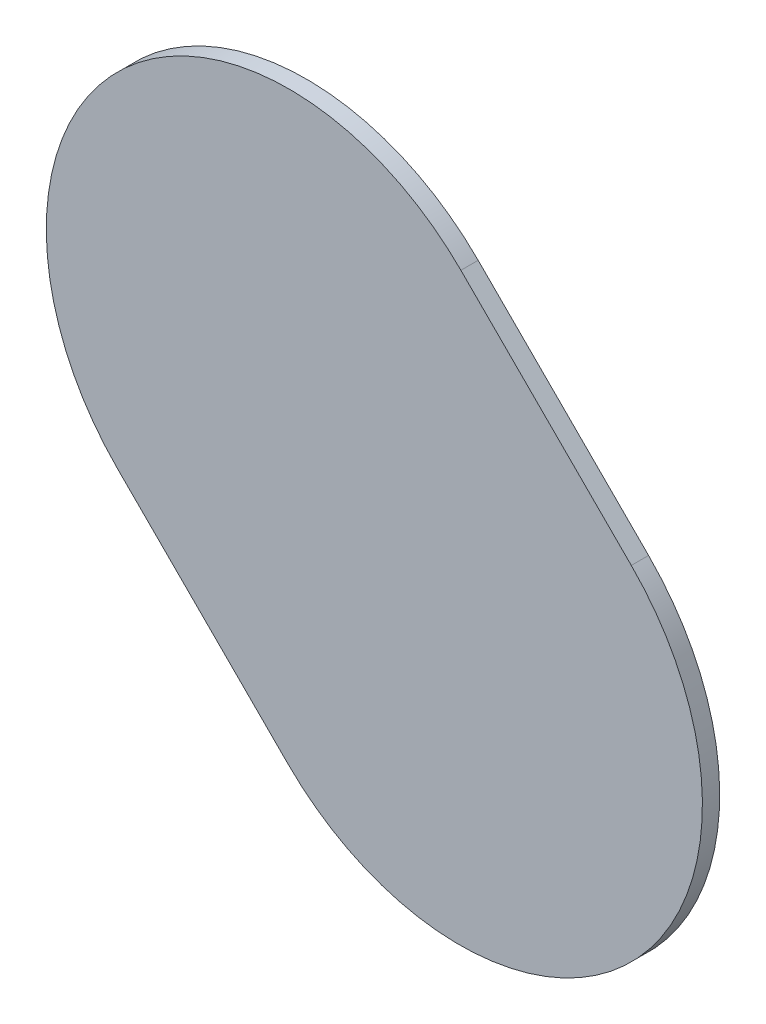
ISO-10303-21;
HEADER;
FILE_DESCRIPTION(('STEP AP214'),'2;1');
FILE_NAME('part.step','',(''),(''),'','','');
FILE_SCHEMA(('AUTOMOTIVE_DESIGN { 1 0 10303 214 1 1 1 1 }'));
ENDSEC;
DATA;
#1=APPLICATION_CONTEXT('core data for automotive mechanical design processes');
#2=APPLICATION_PROTOCOL_DEFINITION('international standard','automotive_design',2000,#1);
#3=PRODUCT_CONTEXT('',#1,'mechanical');
#4=PRODUCT('Part','Part','',(#3));
#5=PRODUCT_RELATED_PRODUCT_CATEGORY('part','',(#4));
#6=PRODUCT_DEFINITION_FORMATION('','',#4);
#7=PRODUCT_DEFINITION_CONTEXT('part definition',#1,'design');
#8=PRODUCT_DEFINITION('design','',#6,#7);
#9=PRODUCT_DEFINITION_SHAPE('','',#8);
#10=(LENGTH_UNIT() NAMED_UNIT(*) SI_UNIT(.MILLI.,.METRE.));
#11=(NAMED_UNIT(*) PLANE_ANGLE_UNIT() SI_UNIT($,.RADIAN.));
#12=(NAMED_UNIT(*) SI_UNIT($,.STERADIAN.) SOLID_ANGLE_UNIT());
#13=UNCERTAINTY_MEASURE_WITH_UNIT(LENGTH_MEASURE(1.E-05),#10,'distance_accuracy_value','');
#14=(GEOMETRIC_REPRESENTATION_CONTEXT(3) GLOBAL_UNCERTAINTY_ASSIGNED_CONTEXT((#13)) GLOBAL_UNIT_ASSIGNED_CONTEXT((#10,
#11,#12)) REPRESENTATION_CONTEXT('',''));
#15=CARTESIAN_POINT('',(0.,0.,0.));
#16=DIRECTION('',(0.,0.,1.));
#17=DIRECTION('',(1.,0.,0.));
#18=AXIS2_PLACEMENT_3D('',#15,#16,#17);
#19=CARTESIAN_POINT('',(34.65562284,114.91484764,0.));
#20=DIRECTION('',(0.707106781186562,0.707106781186533,0.));
#21=DIRECTION('',(0.707106781186533,-0.707106781186562,0.));
#22=AXIS2_PLACEMENT_3D('',#19,#20,#21);
#23=PLANE('',#22);
#24=DIRECTION('',(0.707106781186533,-0.707106781186562,0.));
#25=VECTOR('',#24,1.);
#26=CARTESIAN_POINT('',(34.65562284,114.91484764,0.03556));
#27=LINE('',#26,#25);
#28=CARTESIAN_POINT('',(34.65562284,114.91484764,0.03556));
#29=VERTEX_POINT('',#28);
#30=CARTESIAN_POINT('',(35.00644764,114.56402284,0.03556));
#31=VERTEX_POINT('',#30);
#32=EDGE_CURVE('E11',#29,#31,#27,.T.);
#33=ORIENTED_EDGE('',*,*,#32,.F.);
#34=DIRECTION('',(0.,0.,1.));
#35=VECTOR('',#34,1.);
#36=CARTESIAN_POINT('',(34.65562284,114.91484764,0.));
#37=LINE('',#36,#35);
#38=CARTESIAN_POINT('',(34.65562284,114.91484764,0.));
#39=VERTEX_POINT('',#38);
#40=EDGE_CURVE('E24',#39,#29,#37,.T.);
#41=ORIENTED_EDGE('',*,*,#40,.F.);
#42=DIRECTION('',(0.707106781186533,-0.707106781186562,0.));
#43=VECTOR('',#42,1.);
#44=CARTESIAN_POINT('',(34.65562284,114.91484764,0.));
#45=LINE('',#44,#43);
#46=CARTESIAN_POINT('',(35.00644764,114.56402284,0.));
#47=VERTEX_POINT('',#46);
#48=EDGE_CURVE('E75',#39,#47,#45,.T.);
#49=ORIENTED_EDGE('',*,*,#48,.T.);
#50=DIRECTION('',(0.,0.,1.));
#51=VECTOR('',#50,1.);
#52=CARTESIAN_POINT('',(35.00644764,114.56402284,0.));
#53=LINE('',#52,#51);
#54=EDGE_CURVE('E37',#47,#31,#53,.T.);
#55=ORIENTED_EDGE('',*,*,#54,.T.);
#56=EDGE_LOOP('',(#33,#41,#49,#55));
#57=FACE_BOUND('',#56,.T.);
#58=ADVANCED_FACE('F17',(#57),#23,.F.);
#59=CARTESIAN_POINT('',(35.3600004,114.9175756,0.));
#60=DIRECTION('',(0.,0.,-1.));
#61=DIRECTION('',(-0.707106781186548,-0.707106781186548,0.));
#62=AXIS2_PLACEMENT_3D('',#59,#60,#61);
#63=CYLINDRICAL_SURFACE('',#62,0.499999108206439);
#64=CARTESIAN_POINT('',(35.3600004,114.9175756,0.03556));
#65=DIRECTION('',(0.,0.,1.));
#66=DIRECTION('',(-0.707106781186548,-0.707106781186548,0.));
#67=AXIS2_PLACEMENT_3D('',#64,#65,#66);
#68=CIRCLE('',#67,0.499999108206439);
#69=CARTESIAN_POINT('',(35.71355316,115.27112836,0.03556));
#70=VERTEX_POINT('',#69);
#71=EDGE_CURVE('E83',#31,#70,#68,.T.);
#72=ORIENTED_EDGE('',*,*,#71,.F.);
#73=ORIENTED_EDGE('',*,*,#54,.F.);
#74=CARTESIAN_POINT('',(35.3600004,114.9175756,0.));
#75=DIRECTION('',(0.,0.,1.));
#76=DIRECTION('',(-0.707106781186548,-0.707106781186548,0.));
#77=AXIS2_PLACEMENT_3D('',#74,#75,#76);
#78=CIRCLE('',#77,0.499999108206439);
#79=CARTESIAN_POINT('',(35.71355316,115.27112836,0.));
#80=VERTEX_POINT('',#79);
#81=EDGE_CURVE('E81',#47,#80,#78,.T.);
#82=ORIENTED_EDGE('',*,*,#81,.T.);
#83=DIRECTION('',(0.,0.,1.));
#84=VECTOR('',#83,1.);
#85=CARTESIAN_POINT('',(35.71355316,115.27112836,0.));
#86=LINE('',#85,#84);
#87=EDGE_CURVE('E67',#80,#70,#86,.T.);
#88=ORIENTED_EDGE('',*,*,#87,.T.);
#89=EDGE_LOOP('',(#72,#73,#82,#88));
#90=FACE_BOUND('',#89,.T.);
#91=ADVANCED_FACE('F89',(#90),#63,.T.);
#92=CARTESIAN_POINT('',(35.71355316,115.27112836,0.));
#93=DIRECTION('',(-0.707106781186548,-0.707106781186548,0.));
#94=DIRECTION('',(-0.707106781186548,0.707106781186548,0.));
#95=AXIS2_PLACEMENT_3D('',#92,#93,#94);
#96=PLANE('',#95);
#97=DIRECTION('',(-0.707106781186548,0.707106781186548,0.));
#98=VECTOR('',#97,1.);
#99=CARTESIAN_POINT('',(35.71355316,115.27112836,0.03556));
#100=LINE('',#99,#98);
#101=CARTESIAN_POINT('',(35.36272836,115.62195316,0.03556));
#102=VERTEX_POINT('',#101);
#103=EDGE_CURVE('E71',#70,#102,#100,.T.);
#104=ORIENTED_EDGE('',*,*,#103,.F.);
#105=ORIENTED_EDGE('',*,*,#87,.F.);
#106=DIRECTION('',(-0.707106781186548,0.707106781186548,0.));
#107=VECTOR('',#106,1.);
#108=CARTESIAN_POINT('',(35.71355316,115.27112836,0.));
#109=LINE('',#108,#107);
#110=CARTESIAN_POINT('',(35.36272836,115.62195316,0.));
#111=VERTEX_POINT('',#110);
#112=EDGE_CURVE('E63',#80,#111,#109,.T.);
#113=ORIENTED_EDGE('',*,*,#112,.T.);
#114=DIRECTION('',(0.,0.,1.));
#115=VECTOR('',#114,1.);
#116=CARTESIAN_POINT('',(35.36272836,115.62195316,0.));
#117=LINE('',#116,#115);
#118=EDGE_CURVE('E53',#111,#102,#117,.T.);
#119=ORIENTED_EDGE('',*,*,#118,.T.);
#120=EDGE_LOOP('',(#104,#105,#113,#119));
#121=FACE_BOUND('',#120,.T.);
#122=ADVANCED_FACE('F66',(#121),#96,.F.);
#123=CARTESIAN_POINT('',(35.0091756,115.2684004,0.));
#124=DIRECTION('',(0.,0.,-1.));
#125=DIRECTION('',(0.707106781186548,0.707106781186548,0.));
#126=AXIS2_PLACEMENT_3D('',#123,#124,#125);
#127=CYLINDRICAL_SURFACE('',#126,0.499999108206436);
#128=CARTESIAN_POINT('',(35.0091756,115.2684004,0.03556));
#129=DIRECTION('',(0.,0.,1.));
#130=DIRECTION('',(0.707106781186548,0.707106781186548,0.));
#131=AXIS2_PLACEMENT_3D('',#128,#129,#130);
#132=CIRCLE('',#131,0.499999108206436);
#133=EDGE_CURVE('E59',#102,#29,#132,.T.);
#134=ORIENTED_EDGE('',*,*,#133,.F.);
#135=ORIENTED_EDGE('',*,*,#118,.F.);
#136=CARTESIAN_POINT('',(35.0091756,115.2684004,0.));
#137=DIRECTION('',(0.,0.,1.));
#138=DIRECTION('',(0.707106781186548,0.707106781186548,0.));
#139=AXIS2_PLACEMENT_3D('',#136,#137,#138);
#140=CIRCLE('',#139,0.499999108206436);
#141=EDGE_CURVE('E57',#111,#39,#140,.T.);
#142=ORIENTED_EDGE('',*,*,#141,.T.);
#143=ORIENTED_EDGE('',*,*,#40,.T.);
#144=EDGE_LOOP('',(#134,#135,#142,#143));
#145=FACE_BOUND('',#144,.T.);
#146=ADVANCED_FACE('F55',(#145),#127,.T.);
#147=CARTESIAN_POINT('',(34.65562284,114.91484764,0.));
#148=DIRECTION('',(0.,0.,-1.));
#149=DIRECTION('',(-1.,0.,0.));
#150=AXIS2_PLACEMENT_3D('',#147,#148,#149);
#151=PLANE('',#150);
#152=ORIENTED_EDGE('',*,*,#141,.F.);
#153=ORIENTED_EDGE('',*,*,#112,.F.);
#154=ORIENTED_EDGE('',*,*,#81,.F.);
#155=ORIENTED_EDGE('',*,*,#48,.F.);
#156=EDGE_LOOP('',(#152,#153,#154,#155));
#157=FACE_BOUND('',#156,.T.);
#158=ADVANCED_FACE('F74',(#157),#151,.T.);
#159=CARTESIAN_POINT('',(34.65562284,114.91484764,0.03556));
#160=DIRECTION('',(0.,0.,-1.));
#161=DIRECTION('',(-1.,0.,0.));
#162=AXIS2_PLACEMENT_3D('',#159,#160,#161);
#163=PLANE('',#162);
#164=ORIENTED_EDGE('',*,*,#32,.T.);
#165=ORIENTED_EDGE('',*,*,#71,.T.);
#166=ORIENTED_EDGE('',*,*,#103,.T.);
#167=ORIENTED_EDGE('',*,*,#133,.T.);
#168=EDGE_LOOP('',(#164,#165,#166,#167));
#169=FACE_BOUND('',#168,.T.);
#170=ADVANCED_FACE('F91',(#169),#163,.F.);
#171=CLOSED_SHELL('',(#58,#91,#122,#146,#158,#170));
#172=MANIFOLD_SOLID_BREP('B1',#171);
#173=ADVANCED_BREP_SHAPE_REPRESENTATION('',(#18,#172),#14);
#174=SHAPE_DEFINITION_REPRESENTATION(#9,#173);
ENDSEC;
END-ISO-10303-21;
